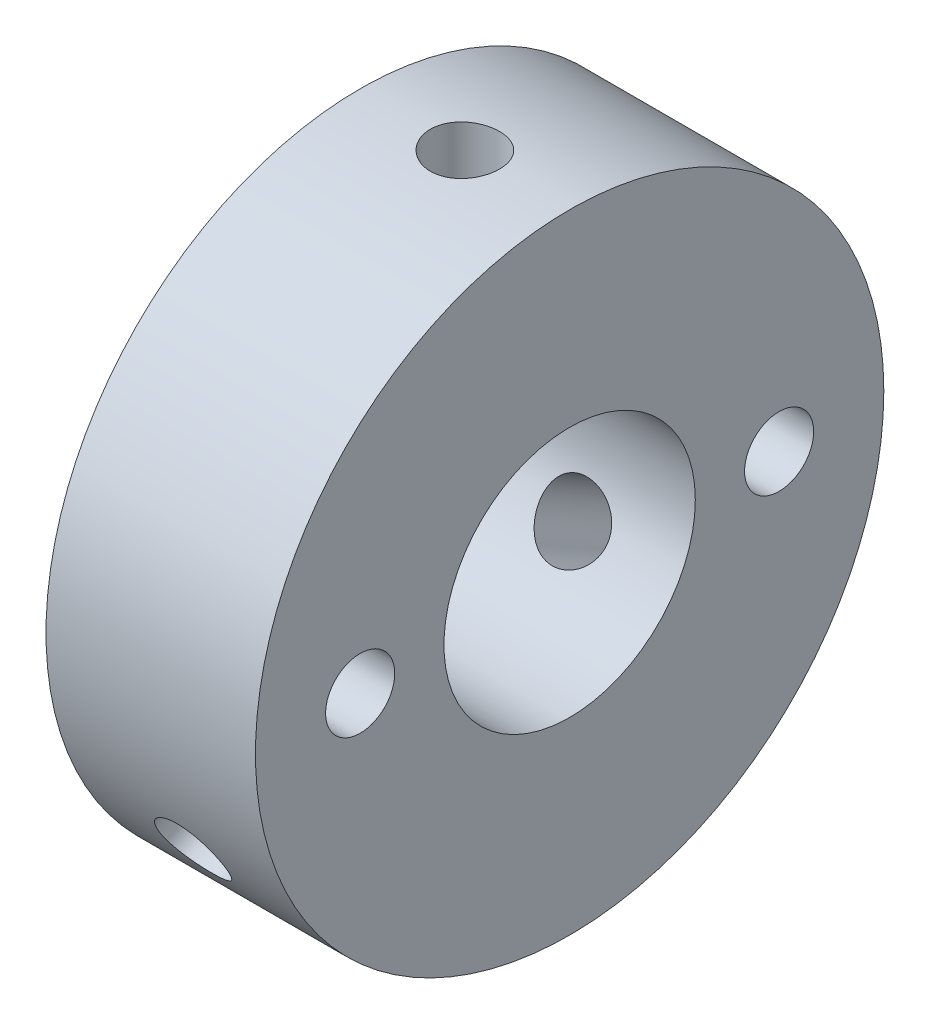
ISO-10303-21;
HEADER;
FILE_DESCRIPTION(('STEP AP214'),'2;1');
FILE_NAME('part.step','',(''),(''),'','','');
FILE_SCHEMA(('AUTOMOTIVE_DESIGN { 1 0 10303 214 1 1 1 1 }'));
ENDSEC;
DATA;
#1=APPLICATION_CONTEXT('core data for automotive mechanical design processes');
#2=APPLICATION_PROTOCOL_DEFINITION('international standard','automotive_design',2000,#1);
#3=PRODUCT_CONTEXT('',#1,'mechanical');
#4=PRODUCT('Part','Part','',(#3));
#5=PRODUCT_RELATED_PRODUCT_CATEGORY('part','',(#4));
#6=PRODUCT_DEFINITION_FORMATION('','',#4);
#7=PRODUCT_DEFINITION_CONTEXT('part definition',#1,'design');
#8=PRODUCT_DEFINITION('design','',#6,#7);
#9=PRODUCT_DEFINITION_SHAPE('','',#8);
#10=(LENGTH_UNIT() NAMED_UNIT(*) SI_UNIT(.MILLI.,.METRE.));
#11=(NAMED_UNIT(*) PLANE_ANGLE_UNIT() SI_UNIT($,.RADIAN.));
#12=(NAMED_UNIT(*) SI_UNIT($,.STERADIAN.) SOLID_ANGLE_UNIT());
#13=UNCERTAINTY_MEASURE_WITH_UNIT(LENGTH_MEASURE(1.E-05),#10,'distance_accuracy_value','');
#14=(GEOMETRIC_REPRESENTATION_CONTEXT(3) GLOBAL_UNCERTAINTY_ASSIGNED_CONTEXT((#13)) GLOBAL_UNIT_ASSIGNED_CONTEXT((#10,
#11,#12)) REPRESENTATION_CONTEXT('',''));
#15=CARTESIAN_POINT('',(0.,0.,0.));
#16=DIRECTION('',(0.,0.,1.));
#17=DIRECTION('',(1.,0.,0.));
#18=AXIS2_PLACEMENT_3D('',#15,#16,#17);
#19=CARTESIAN_POINT('',(10.,0.,0.));
#20=DIRECTION('',(-1.,0.,0.));
#21=DIRECTION('',(0.,0.,1.));
#22=AXIS2_PLACEMENT_3D('',#19,#20,#21);
#23=CYLINDRICAL_SURFACE('',#22,15.);
#24=CARTESIAN_POINT('',(10.,0.,0.));
#25=DIRECTION('',(1.,0.,0.));
#26=DIRECTION('',(0.,0.,-1.));
#27=AXIS2_PLACEMENT_3D('',#24,#25,#26);
#28=CIRCLE('',#27,15.);
#29=CARTESIAN_POINT('',(10.,0.,-15.));
#30=VERTEX_POINT('',#29);
#31=EDGE_CURVE('E10',#30,#30,#28,.T.);
#32=ORIENTED_EDGE('',*,*,#31,.F.);
#33=EDGE_LOOP('',(#32));
#34=FACE_BOUND('',#33,.T.);
#35=CARTESIAN_POINT('',(0.,0.,0.));
#36=DIRECTION('',(1.,0.,0.));
#37=DIRECTION('',(0.,0.,-1.));
#38=AXIS2_PLACEMENT_3D('',#35,#36,#37);
#39=CIRCLE('',#38,15.);
#40=CARTESIAN_POINT('',(0.,0.,-15.));
#41=VERTEX_POINT('',#40);
#42=EDGE_CURVE('E46',#41,#41,#39,.T.);
#43=ORIENTED_EDGE('',*,*,#42,.T.);
#44=EDGE_LOOP('',(#43));
#45=FACE_BOUND('',#44,.T.);
#46=CARTESIAN_POINT('',(3.35,15.,0.));
#47=CARTESIAN_POINT('',(3.35000397407824,14.9999988431375,0.0923818218581744));
#48=CARTESIAN_POINT('',(3.35778468265795,14.9991375118722,0.184823472950829));
#49=CARTESIAN_POINT('',(3.38870399434833,14.9957843241747,0.36714038463706));
#50=CARTESIAN_POINT('',(3.41185918763366,14.9932907064293,0.457012763410701));
#51=CARTESIAN_POINT('',(3.47284213795445,14.9869542195955,0.631524868732986));
#52=CARTESIAN_POINT('',(3.51066065247303,14.9831122005694,0.716167852564646));
#53=CARTESIAN_POINT('',(3.59987789047906,14.9745076566348,0.877887506534782));
#54=CARTESIAN_POINT('',(3.65127405277463,14.9697453053767,0.954965599904045));
#55=CARTESIAN_POINT('',(3.76642513016234,14.9598099458213,1.09971749291982));
#56=CARTESIAN_POINT('',(3.83022676384704,14.9546354302355,1.16735402776654));
#57=CARTESIAN_POINT('',(3.96827771795948,14.9444712876292,1.29098229654243));
#58=CARTESIAN_POINT('',(4.04252753906488,14.9394816694836,1.34697347210661));
#59=CARTESIAN_POINT('',(4.1996041169707,14.9302371294103,1.44585644392366));
#60=CARTESIAN_POINT('',(4.28245253227903,14.9259841384625,1.4887140314528));
#61=CARTESIAN_POINT('',(4.45422484675052,14.9187136159983,1.55989482430128));
#62=CARTESIAN_POINT('',(4.54314856597328,14.9156960479094,1.58821845988081));
#63=CARTESIAN_POINT('',(4.72416431324198,14.9112520065666,1.62941572162321));
#64=CARTESIAN_POINT('',(4.81624200529499,14.9098191204392,1.64235163484851));
#65=CARTESIAN_POINT('',(5.00127181424992,14.908686898868,1.65259886462405));
#66=CARTESIAN_POINT('',(5.09422390354157,14.908987508869,1.64991067288424));
#67=CARTESIAN_POINT('',(5.27793281906692,14.9112824512349,1.62903725829947));
#68=CARTESIAN_POINT('',(5.36869750429989,14.9132693261476,1.61092026760878));
#69=CARTESIAN_POINT('',(5.54589026922768,14.9187012894236,1.55980980676325));
#70=CARTESIAN_POINT('',(5.63231827929606,14.9221464011908,1.5268160978437));
#71=CARTESIAN_POINT('',(5.79859852959656,14.9301152023445,1.446814196343));
#72=CARTESIAN_POINT('',(5.8784362019399,14.9346411994129,1.39977596429643));
#73=CARTESIAN_POINT('',(6.02910998413144,14.944259925937,1.29304180674751));
#74=CARTESIAN_POINT('',(6.09994577484581,14.9493526754732,1.23334543269006));
#75=CARTESIAN_POINT('',(6.23100135292739,14.9595642939927,1.10260955971917));
#76=CARTESIAN_POINT('',(6.29116241529601,14.9646831571922,1.03151117609732));
#77=CARTESIAN_POINT('',(6.39870484603087,14.9743446474524,0.88019332942712));
#78=CARTESIAN_POINT('',(6.44608619509901,14.978887273643,0.799973852605646));
#79=CARTESIAN_POINT('',(6.52672275506592,14.9868864198642,0.632648549173301));
#80=CARTESIAN_POINT('',(6.55997472600503,14.9903426907391,0.545541148541532));
#81=CARTESIAN_POINT('',(6.61136425628381,14.9957772807096,0.366932993265997));
#82=CARTESIAN_POINT('',(6.62950236288869,14.9977556533188,0.275432397824439));
#83=CARTESIAN_POINT('',(6.65007418859382,15.0000046359516,0.0911434787578463));
#84=CARTESIAN_POINT('',(6.65258889119219,15.0002840523084,-0.00163570174845483));
#85=CARTESIAN_POINT('',(6.64205560627016,14.9991273146614,-0.186294166416551));
#86=CARTESIAN_POINT('',(6.62900787403707,14.9976911887995,-0.278173465315143));
#87=CARTESIAN_POINT('',(6.58778731886137,14.9932703044021,-0.45818836055987));
#88=CARTESIAN_POINT('',(6.55965267471051,14.9902894555646,-0.546332803398984));
#89=CARTESIAN_POINT('',(6.48909634060412,14.9831132635213,-0.716651536032795));
#90=CARTESIAN_POINT('',(6.44667426744437,14.9789178877409,-0.798825665625389));
#91=CARTESIAN_POINT('',(6.3485482782607,14.9697593637147,-0.955235638443859));
#92=CARTESIAN_POINT('',(6.29279146137031,14.9647931858517,-1.02943811324488));
#93=CARTESIAN_POINT('',(6.16965418632295,14.9546593253991,-1.1674600255377));
#94=CARTESIAN_POINT('',(6.10227337372175,14.9494916366686,-1.23127914630015));
#95=CARTESIAN_POINT('',(5.95744616179261,14.9395104302445,-1.34700625191035));
#96=CARTESIAN_POINT('',(5.87995700069063,14.9346985615749,-1.39886088486303));
#97=CARTESIAN_POINT('',(5.71732235207821,14.9259997112416,-1.48881961499014));
#98=CARTESIAN_POINT('',(5.63217698801198,14.9221127146694,-1.52692393381705));
#99=CARTESIAN_POINT('',(5.45682581030272,14.9157144017887,-1.5882121698463));
#100=CARTESIAN_POINT('',(5.36663098279506,14.913200217783,-1.61142720744416));
#101=CARTESIAN_POINT('',(5.18359422001476,14.9098235690547,-1.64237859902929));
#102=CARTESIAN_POINT('',(5.09075237824812,14.9089610460603,-1.65011549909774));
#103=CARTESIAN_POINT('',(4.9055874603336,14.9089867901201,-1.64988250778876));
#104=CARTESIAN_POINT('',(4.81326426608027,14.9098657154103,-1.64199642382743));
#105=CARTESIAN_POINT('',(4.63126321364289,14.9132553441701,-1.61091769726743));
#106=CARTESIAN_POINT('',(4.54158535753993,14.9157660489234,-1.58772504262743));
#107=CARTESIAN_POINT('',(4.36742518682386,14.9221336424926,-1.52671583943657));
#108=CARTESIAN_POINT('',(4.28294178848482,14.9259902493827,-1.48890235332836));
#109=CARTESIAN_POINT('',(4.1215068615654,14.9346156407071,-1.39973329169088));
#110=CARTESIAN_POINT('',(4.04455534231397,14.9393844262711,-1.34837769938871));
#111=CARTESIAN_POINT('',(3.8999392703203,14.9493275259266,-1.23326864168925));
#112=CARTESIAN_POINT('',(3.83232460764932,14.9545038027611,-1.16945266430597));
#113=CARTESIAN_POINT('',(3.70872907899544,14.9646609076263,-1.03136150958025));
#114=CARTESIAN_POINT('',(3.65275098597638,14.969641688842,-0.957083846303535));
#115=CARTESIAN_POINT('',(3.55388123329121,14.9788625057048,-0.799929681435439));
#116=CARTESIAN_POINT('',(3.51102915416636,14.9831002847694,-0.717028162742398));
#117=CARTESIAN_POINT('',(3.43991277149216,14.9903338724846,-0.545209885523752));
#118=CARTESIAN_POINT('',(3.41163224210026,14.993331061833,-0.456299942937422));
#119=CARTESIAN_POINT('',(3.37740874233583,14.9970040251543,-0.305751892942928));
#120=CARTESIAN_POINT('',(3.3671447762129,14.9981221898992,-0.245071615108732));
#121=CARTESIAN_POINT('',(3.35343910055461,14.9996205603388,-0.122936388450104));
#122=CARTESIAN_POINT('',(3.34999735519324,15.0000007699088,-0.0614814436954419));
#123=CARTESIAN_POINT('',(3.35,15.,0.));
#124=B_SPLINE_CURVE_WITH_KNOTS('',3,(#46,#47,#48,#49,#50,#51,#52,#53,#54,#55,#56,#57,#58,#59,
#60,#61,#62,#63,#64,#65,#66,#67,#68,#69,#70,#71,#72,#73,#74,#75,#76,#77,#78,#79,#80,#81,#82,#83,
#84,#85,#86,#87,#88,#89,#90,#91,#92,#93,#94,#95,#96,#97,#98,#99,#100,#101,#102,#103,#104,#105,
#106,#107,#108,#109,#110,#111,#112,#113,#114,#115,#116,#117,#118,#119,#120,#121,#122,#123),
.UNSPECIFIED.,.T.,.F.,(4,2,2,2,2,2,2,2,2,2,2,2,2,2,2,2,2,2,2,2,2,2,2,2,2,2,2,2,2,2,2,2,2,2,2,2,
2,2,4),(0.,0.276920934615254,0.554141173519899,0.831186959564197,1.10818052291128,
1.38623817794144,1.66430916204827,1.94309839229293,2.22187936884106,2.4995280019088,
2.77716789707699,3.05358629881209,3.33000913709783,3.60702749676352,3.88405567451859,
4.16256356312763,4.44107187229719,4.71964401084108,4.99820606199367,5.27532298117503,
5.5524353545728,5.82884975677339,6.10527157329623,6.3828087371903,6.66035436537183,
6.9391146816353,7.21787050413386,7.49604177805969,7.77420323770548,8.05087657749381,
8.32755013493494,8.60416577239309,8.88078175246171,9.15882288790672,9.43693020406013,
9.71586805930811,9.99449463424158,10.1787905045231,10.3630854069962),.UNSPECIFIED.);
#125=CARTESIAN_POINT('',(3.35,15.,0.));
#126=VERTEX_POINT('',#125);
#127=EDGE_CURVE('E63',#126,#126,#124,.T.);
#128=ORIENTED_EDGE('',*,*,#127,.F.);
#129=EDGE_LOOP('',(#128));
#130=FACE_BOUND('',#129,.T.);
#131=CARTESIAN_POINT('',(5.,-8.88342882011627,-12.0865500618633));
#132=CARTESIAN_POINT('',(4.90762008453076,-8.88342596860774,-12.0865530744519));
#133=CARTESIAN_POINT('',(4.81518033398471,-8.87712129213728,-12.0911938510877));
#134=CARTESIAN_POINT('',(4.63286737097806,-8.85203171457936,-12.1095733625383));
#135=CARTESIAN_POINT('',(4.54299704183349,-8.83323332583007,-12.1233219296705));
#136=CARTESIAN_POINT('',(4.36848927100874,-8.78360634746329,-12.1593253710765));
#137=CARTESIAN_POINT('',(4.28384855469194,-8.75278537632487,-12.181574858298));
#138=CARTESIAN_POINT('',(4.12213270201396,-8.6798411607914,-12.2336566995255));
#139=CARTESIAN_POINT('',(4.04505614523161,-8.63772004394046,-12.2634876260743));
#140=CARTESIAN_POINT('',(3.90030252503362,-8.54297311350918,-12.3296777375812));
#141=CARTESIAN_POINT('',(3.83266321124539,-8.49030705442919,-12.3660618781921));
#142=CARTESIAN_POINT('',(3.709029576799,-8.37582823968056,-12.4438853254357));
#143=CARTESIAN_POINT('',(3.6530358059785,-8.31401505237121,-12.4853248706099));
#144=CARTESIAN_POINT('',(3.55415011403971,-8.1825916556994,-12.5718490943613));
#145=CARTESIAN_POINT('',(3.51129192672872,-8.11296198823144,-12.6169427883055));
#146=CARTESIAN_POINT('',(3.44010988513695,-7.96782347734139,-12.7090979368542));
#147=CARTESIAN_POINT('',(3.41178560764294,-7.89231480518393,-12.7561593341179));
#148=CARTESIAN_POINT('',(3.37058701380557,-7.73776210934497,-12.8504940164369));
#149=CARTESIAN_POINT('',(3.35765035112212,-7.6587337073936,-12.8977656621133));
#150=CARTESIAN_POINT('',(3.34740118393401,-7.49905814680017,-12.9912541359613));
#151=CARTESIAN_POINT('',(3.35008819590006,-7.41841103833161,-13.0374709967323));
#152=CARTESIAN_POINT('',(3.37095973653297,-7.25816936633248,-13.1273524835692));
#153=CARTESIAN_POINT('',(3.38907722085951,-7.17857175984739,-13.1710272790022));
#154=CARTESIAN_POINT('',(3.4401908370904,-7.02240549017441,-13.2549494322858));
#155=CARTESIAN_POINT('',(3.47318719654549,-6.94583687332998,-13.2951967377068));
#156=CARTESIAN_POINT('',(3.55319459863276,-6.79785805700242,-13.3714650279887));
#157=CARTESIAN_POINT('',(3.60023506437928,-6.7264590822902,-13.4074769164339));
#158=CARTESIAN_POINT('',(3.7069739960156,-6.59116997153729,-13.4745013662155));
#159=CARTESIAN_POINT('',(3.76667291151885,-6.52728010233665,-13.5055137499065));
#160=CARTESIAN_POINT('',(3.89741059469749,-6.40867939413014,-13.56219675782));
#161=CARTESIAN_POINT('',(3.96850772630399,-6.35401894310649,-13.5878382315351));
#162=CARTESIAN_POINT('',(4.11982200127161,-6.25604895652372,-13.6332232388479));
#163=CARTESIAN_POINT('',(4.20003916285253,-6.21273944364184,-13.6529667606625));
#164=CARTESIAN_POINT('',(4.36736382343207,-6.13889298424707,-13.6863305304383));
#165=CARTESIAN_POINT('',(4.45447326264678,-6.10835964962303,-13.6999490469115));
#166=CARTESIAN_POINT('',(4.63308585137504,-6.0611243780417,-13.7209126921833));
#167=CARTESIAN_POINT('',(4.72458883805088,-6.04442192888934,-13.7282580532941));
#168=CARTESIAN_POINT('',(4.90887889420228,-6.02547738993881,-13.736583661443));
#169=CARTESIAN_POINT('',(5.00165674860581,-6.02316015197064,-13.7375969871412));
#170=CARTESIAN_POINT('',(5.18631226067988,-6.03286598936873,-13.7333373561973));
#171=CARTESIAN_POINT('',(5.27818993309758,-6.04488882941256,-13.7280645027121));
#172=CARTESIAN_POINT('',(5.45819661170017,-6.08280929549117,-13.7113038978248));
#173=CARTESIAN_POINT('',(5.54633464214435,-6.10867119654958,-13.6998321478787));
#174=CARTESIAN_POINT('',(5.71664130405737,-6.1733732361447,-13.6707978149811));
#175=CARTESIAN_POINT('',(5.79880977110028,-6.21221373199957,-13.6532350643357));
#176=CARTESIAN_POINT('',(5.95521584479918,-6.30177958545036,-13.6121270498285));
#177=CARTESIAN_POINT('',(6.02941947013616,-6.35255313035049,-13.5885574962154));
#178=CARTESIAN_POINT('',(6.16744410418428,-6.46426268842556,-13.5357716618075));
#179=CARTESIAN_POINT('',(6.23126480126433,-6.52519900651277,-13.5065552115854));
#180=CARTESIAN_POINT('',(6.3469953716167,-6.65560765314548,-13.4427738303876));
#181=CARTESIAN_POINT('',(6.3988518542153,-6.72511619840309,-13.4081860348307));
#182=CARTESIAN_POINT('',(6.48881382867269,-6.87029945964232,-13.3343769142981));
#183=CARTESIAN_POINT('',(6.5269195428737,-6.94597407589777,-13.2951556642563));
#184=CARTESIAN_POINT('',(6.58820868907663,-7.10101594301963,-13.2129953740799));
#185=CARTESIAN_POINT('',(6.6114238461492,-7.1803749543691,-13.1700644606553));
#186=CARTESIAN_POINT('',(6.64237630697435,-7.34056367355119,-13.0814562831971));
#187=CARTESIAN_POINT('',(6.6501141436608,-7.42139333064805,-13.0357791137817));
#188=CARTESIAN_POINT('',(6.64988390908325,-7.58173956281552,-12.9431739754115));
#189=CARTESIAN_POINT('',(6.64199850940514,-7.661260816384,-12.89625387966));
#190=CARTESIAN_POINT('',(6.61091964712493,-7.81720078165753,-12.8023302556249));
#191=CARTESIAN_POINT('',(6.58772618000518,-7.89361949244696,-12.7553267273167));
#192=CARTESIAN_POINT('',(6.52671364489208,-8.04128555182023,-12.6627534761083));
#193=CARTESIAN_POINT('',(6.48889758597174,-8.11253396078126,-12.6171834603014));
#194=CARTESIAN_POINT('',(6.39972197074954,-8.24804859871279,-12.5290158214555));
#195=CARTESIAN_POINT('',(6.34836240274566,-8.31231482165039,-12.4864182009847));
#196=CARTESIAN_POINT('',(6.23324894305902,-8.43259100958611,-12.4055107908105));
#197=CARTESIAN_POINT('',(6.16943345063016,-8.48855740208754,-12.3672238678625));
#198=CARTESIAN_POINT('',(6.0313444562852,-8.59050762643331,-12.2966269619942));
#199=CARTESIAN_POINT('',(5.95706846189108,-8.63648907245583,-12.2643184078285));
#200=CARTESIAN_POINT('',(5.79991568588812,-8.71748777958903,-12.2068786918238));
#201=CARTESIAN_POINT('',(5.717013585826,-8.75247147983865,-12.1817695198235));
#202=CARTESIAN_POINT('',(5.5451940816102,-8.81042645168114,-12.1399207234807));
#203=CARTESIAN_POINT('',(5.45628349743709,-8.83341109259968,-12.123171785101));
#204=CARTESIAN_POINT('',(5.3057375223919,-8.86120115730731,-12.1028629228983));
#205=CARTESIAN_POINT('',(5.24506011398443,-8.86952685743923,-12.0967574768708));
#206=CARTESIAN_POINT('',(5.12293063432609,-8.88064162282287,-12.0886000547953));
#207=CARTESIAN_POINT('',(5.06147856723423,-8.88343071778697,-12.0865480569943));
#208=CARTESIAN_POINT('',(5.,-8.88342882011627,-12.0865500618633));
#209=B_SPLINE_CURVE_WITH_KNOTS('',3,(#131,#132,#133,#134,#135,#136,#137,#138,#139,#140,#141,
#142,#143,#144,#145,#146,#147,#148,#149,#150,#151,#152,#153,#154,#155,#156,#157,#158,#159,#160,
#161,#162,#163,#164,#165,#166,#167,#168,#169,#170,#171,#172,#173,#174,#175,#176,#177,#178,#179,
#180,#181,#182,#183,#184,#185,#186,#187,#188,#189,#190,#191,#192,#193,#194,#195,#196,#197,#198,
#199,#200,#201,#202,#203,#204,#205,#206,#207,#208),.UNSPECIFIED.,.T.,.F.,(4,2,2,2,2,2,2,2,2,2,2,
2,2,2,2,2,2,2,2,2,2,2,2,2,2,2,2,2,2,2,2,2,2,2,2,2,2,2,4),(0.,0.276915207983228,0.55412984807806,
0.831169107214858,1.10815624312097,1.38622139272367,1.6642996680345,1.94308621188647,
2.22186463728611,2.49950964000065,2.77714605006442,3.05358226726651,3.33002271230179,
3.6070464274689,3.88407998384552,4.16258025681133,4.44108108616879,4.71966059598155,
4.99822978878068,5.27534250635456,5.55245067653742,5.8288469299171,6.10525079348408,
6.38279059615242,6.6603387273074,6.93910245036021,7.21786166575788,7.49602498056476,
7.77417871715016,8.0508645121498,8.32755038880394,8.6041793586312,8.88080856747543,
9.15884219031833,9.43694217411332,9.71588275341207,9.99451187080733,10.1787991318224,
10.3630854038514),.UNSPECIFIED.);
#210=CARTESIAN_POINT('',(5.,-8.88342882011627,-12.0865500618633));
#211=VERTEX_POINT('',#210);
#212=EDGE_CURVE('E124',#211,#211,#209,.T.);
#213=ORIENTED_EDGE('',*,*,#212,.F.);
#214=EDGE_LOOP('',(#213));
#215=FACE_BOUND('',#214,.T.);
#216=CARTESIAN_POINT('',(5.,-6.0255449876278,13.7365500618632));
#217=CARTESIAN_POINT('',(4.90762008453076,-6.02554902236031,13.7365490986787));
#218=CARTESIAN_POINT('',(4.81518033398471,-6.03272039105548,13.7334094770105));
#219=CARTESIAN_POINT('',(4.63286737097806,-6.06118230365978,13.7208710212004));
#220=CARTESIAN_POINT('',(4.54299704183349,-6.08248810643653,13.7114654225594));
#221=CARTESIAN_POINT('',(4.36848927100874,-6.13848149050118,13.6864889192837));
#222=CARTESIAN_POINT('',(4.28384855469194,-6.17316059722537,13.6709219189193));
#223=CARTESIAN_POINT('',(4.12213270201396,-6.25473690257104,13.633791295822));
#224=CARTESIAN_POINT('',(4.04505614523161,-6.30163180120621,13.6122288018677));
#225=CARTESIAN_POINT('',(3.90030252503362,-6.40632758446612,13.563270608937));
#226=CARTESIAN_POINT('',(3.83266321124539,-6.46417020407005,13.535852534162));
#227=CARTESIAN_POINT('',(3.709029576799,-6.58880669376738,13.4756226960164));
#228=CARTESIAN_POINT('',(3.6530358059785,-6.65560098626416,13.4428106781047));
#229=CARTESIAN_POINT('',(3.55415011403971,-6.79624486041153,13.3722567898109));
#230=CARTESIAN_POINT('',(3.51129192672872,-6.87011197865169,13.3345025758987));
#231=CARTESIAN_POINT('',(3.44010988513695,-7.02248993382941,13.2548865126749));
#232=CARTESIAN_POINT('',(3.41178560764294,-7.10100063547609,13.2130247830123));
#233=CARTESIAN_POINT('',(3.37058701380557,-7.2599732147417,13.1263455633519));
#234=CARTESIAN_POINT('',(3.35765035112212,-7.34042586175191,13.0815407824797));
#235=CARTESIAN_POINT('',(3.34740118393401,-7.501227035362,12.9900019275663));
#236=CARTESIAN_POINT('',(3.35008819590006,-7.58157556510717,12.9432679132763));
#237=CARTESIAN_POINT('',(3.37095973653297,-7.73953605203735,12.8494352979986));
#238=CARTESIAN_POINT('',(3.38907722085951,-7.81715833763,12.8023391464186));
#239=CARTESIAN_POINT('',(3.4401908370904,-7.96792018915041,12.7090562663093));
#240=CARTESIAN_POINT('',(3.47318719654549,-8.041059686501,12.6628695516999));
#241=CARTESIAN_POINT('',(3.55319459863276,-8.18109937155219,12.5728502826792));
#242=CARTESIAN_POINT('',(3.60023506437928,-8.24798606914001,12.5290229009968));
#243=CARTESIAN_POINT('',(3.7069739960156,-8.37367550070204,12.4453713191202));
#244=CARTESIAN_POINT('',(3.76667291151885,-8.43247794741072,12.4055472611935));
#245=CARTESIAN_POINT('',(3.89741059469749,-8.54086722632991,12.3311775389366));
#246=CARTESIAN_POINT('',(3.96850772630399,-8.59040361946954,12.2966609366254));
#247=CARTESIAN_POINT('',(4.11982200127161,-8.67869318204476,12.2345089430927));
#248=CARTESIAN_POINT('',(4.20003916285253,-8.71744632993729,12.2068735656187));
#249=CARTESIAN_POINT('',(4.36736382343207,-8.78326343182652,12.1596025406912));
#250=CARTESIAN_POINT('',(4.45447326264678,-8.81032408036622,12.1399691554812));
#251=CARTESIAN_POINT('',(4.63308585137504,-8.85209676551817,12.109544032973));
#252=CARTESIAN_POINT('',(4.72458883805088,-8.86680925941624,12.098751968257));
#253=CARTESIAN_POINT('',(4.90887889420228,-8.88349171705046,12.0865083203373));
#254=CARTESIAN_POINT('',(5.00165674860581,-8.88552790183151,12.0850081962394));
#255=CARTESIAN_POINT('',(5.18631226067988,-8.87698603452425,12.0912838825191));
#256=CARTESIAN_POINT('',(5.27818993309758,-8.86640818943373,12.0990595406801));
#257=CARTESIAN_POINT('',(5.45819661170017,-8.83293284677921,12.1235193251839));
#258=CARTESIAN_POINT('',(5.54633464214435,-8.81006706937083,12.1401805135176));
#259=CARTESIAN_POINT('',(5.71664130405737,-8.75257157970202,12.1816969570349));
#260=CARTESIAN_POINT('',(5.79880977110028,-8.71794154355532,12.206552437818));
#261=CARTESIAN_POINT('',(5.95521584479918,-8.6375580319676,12.2635647349645));
#262=CARTESIAN_POINT('',(6.02941947013616,-8.59175942733271,12.2957511378816));
#263=CARTESIAN_POINT('',(6.16744410418428,-8.49019077473793,12.3661015358162));
#264=CARTESIAN_POINT('',(6.23126480126433,-8.43442042759362,12.4042657101818));
#265=CARTESIAN_POINT('',(6.3469953716167,-8.31397980787148,12.4853122204399));
#266=CARTESIAN_POINT('',(6.3988518542153,-8.24927162562951,12.5282144886347));
#267=CARTESIAN_POINT('',(6.48881382867269,-8.11275942159765,12.6170423208058));
#268=CARTESIAN_POINT('',(6.5269195428737,-8.04095551456558,12.6629678358838));
#269=CARTESIAN_POINT('',(6.58820868907663,-7.89228168252957,12.7561578863733));
#270=CARTESIAN_POINT('',(6.6114238461492,-7.81542291522144,12.8034193495088));
#271=CARTESIAN_POINT('',(6.64237630697435,-7.65859162296858,12.8978427609911));
#272=CARTESIAN_POINT('',(6.6501141436608,-7.57861920533349,12.9450047127085));
#273=CARTESIAN_POINT('',(6.64988390908325,-7.41824768690016,13.0375660539815));
#274=CARTESIAN_POINT('',(6.64199850940514,-7.33785306524714,13.0829734318369));
#275=CARTESIAN_POINT('',(6.61091964712493,-7.17854283818048,13.1710595912115));
#276=CARTESIAN_POINT('',(6.58772618000518,-7.09962723320333,13.2137383719255));
#277=CARTESIAN_POINT('',(6.52671364489208,-6.94562341625934,13.2953343050153));
#278=CARTESIAN_POINT('',(6.48889758597174,-6.87053442043917,13.3342522292513));
#279=CARTESIAN_POINT('',(6.39972197074954,-6.72642168644112,13.4075275288617));
#280=CARTESIAN_POINT('',(6.34836240274566,-6.6573979535039,13.4418849002955));
#281=CARTESIAN_POINT('',(6.23324894305902,-6.52719198697074,13.5055934294311));
#282=CARTESIAN_POINT('',(6.16943345063016,-6.46605134281436,13.5349182856215));
#283=CARTESIAN_POINT('',(6.0313444562852,-6.3539375167309,13.5879113168923));
#284=CARTESIAN_POINT('',(5.95706846189108,-6.30296676505263,13.6115781401677));
#285=CARTESIAN_POINT('',(5.79991568588812,-6.21272315823977,13.6530052202164));
#286=CARTESIAN_POINT('',(5.71701358582599,-6.1734861272947,13.6707474073508));
#287=CARTESIAN_POINT('',(5.5451940816102,-6.10826652062277,13.7000134870706));
#288=CARTESIAN_POINT('',(5.45628349743709,-6.08226919404034,13.7115443008131));
#289=CARTESIAN_POINT('',(5.3057375223919,-6.05078617109699,13.7254567717214));
#290=CARTESIAN_POINT('',(5.24506011398443,-6.04133584966981,13.7296143165262));
#291=CARTESIAN_POINT('',(5.12293063432609,-6.02871393223119,13.7351612746677));
#292=CARTESIAN_POINT('',(5.06147856723423,-6.02554230252495,13.7365507028597));
#293=CARTESIAN_POINT('',(5.,-6.0255449876278,13.7365500618632));
#294=B_SPLINE_CURVE_WITH_KNOTS('',3,(#216,#217,#218,#219,#220,#221,#222,#223,#224,#225,#226,
#227,#228,#229,#230,#231,#232,#233,#234,#235,#236,#237,#238,#239,#240,#241,#242,#243,#244,#245,
#246,#247,#248,#249,#250,#251,#252,#253,#254,#255,#256,#257,#258,#259,#260,#261,#262,#263,#264,
#265,#266,#267,#268,#269,#270,#271,#272,#273,#274,#275,#276,#277,#278,#279,#280,#281,#282,#283,
#284,#285,#286,#287,#288,#289,#290,#291,#292,#293),.UNSPECIFIED.,.T.,.F.,(4,2,2,2,2,2,2,2,2,2,2,
2,2,2,2,2,2,2,2,2,2,2,2,2,2,2,2,2,2,2,2,2,2,2,2,2,2,2,4),(0.,0.276915207983227,0.55412984807806,
0.831169107214859,1.10815624312098,1.38622139272367,1.6642996680345,1.94308621188647,
2.22186463728611,2.49950964000065,2.77714605006442,3.05358226726651,3.33002271230179,
3.6070464274689,3.88407998384552,4.16258025681134,4.44108108616879,4.71966059598156,
4.99822978878069,5.27534250635456,5.55245067653742,5.8288469299171,6.10525079348408,
6.38279059615242,6.6603387273074,6.93910245036021,7.21786166575788,7.49602498056476,
7.77417871715016,8.0508645121498,8.32755038880394,8.6041793586312,8.88080856747542,
9.15884219031833,9.43694217411332,9.71588275341208,9.99451187080733,10.1787991318224,
10.3630854038514),.UNSPECIFIED.);
#295=CARTESIAN_POINT('',(5.,-6.0255449876278,13.7365500618632));
#296=VERTEX_POINT('',#295);
#297=EDGE_CURVE('E64',#296,#296,#294,.T.);
#298=ORIENTED_EDGE('',*,*,#297,.F.);
#299=EDGE_LOOP('',(#298));
#300=FACE_BOUND('',#299,.T.);
#301=ADVANCED_FACE('F33',(#34,#45,#130,#215,#300),#23,.T.);
#302=CARTESIAN_POINT('',(10.,0.,0.));
#303=DIRECTION('',(-1.,0.,0.));
#304=DIRECTION('',(0.,0.,1.));
#305=AXIS2_PLACEMENT_3D('',#302,#303,#304);
#306=CYLINDRICAL_SURFACE('',#305,6.);
#307=CARTESIAN_POINT('',(5.,-4.3132745946987,-4.1708107450143));
#308=CARTESIAN_POINT('',(4.90921955335825,-4.31327362433277,-4.17081298940179));
#309=CARTESIAN_POINT('',(4.81841876938433,-4.30784748333641,-4.17644554931393));
#310=CARTESIAN_POINT('',(4.63944729227741,-4.28623748767043,-4.19861883873504));
#311=CARTESIAN_POINT('',(4.55127782986673,-4.27004867899505,-4.21516459150813));
#312=CARTESIAN_POINT('',(4.38018421281183,-4.22722222320144,-4.25811029120501));
#313=CARTESIAN_POINT('',(4.29725257039649,-4.20059990285803,-4.28449578086417));
#314=CARTESIAN_POINT('',(4.13863278184509,-4.13731330507551,-4.34563766751422));
#315=CARTESIAN_POINT('',(4.06294532891123,-4.10064806791561,-4.38039486448355));
#316=CARTESIAN_POINT('',(3.91894953768282,-4.01678542987274,-4.45743715726415));
#317=CARTESIAN_POINT('',(3.85086238877202,-3.96935598238752,-4.49988316555957));
#318=CARTESIAN_POINT('',(3.72595879824098,-3.86518479101696,-4.58966967654381));
#319=CARTESIAN_POINT('',(3.66914358854209,-3.80844203050745,-4.63701071335596));
#320=CARTESIAN_POINT('',(3.56746519622698,-3.68551698127564,-4.73531982788391));
#321=CARTESIAN_POINT('',(3.52282326362093,-3.61918973009713,-4.78633612212823));
#322=CARTESIAN_POINT('',(3.44820386122523,-3.47920383162299,-4.8890351291084));
#323=CARTESIAN_POINT('',(3.41822375527836,-3.40554650512358,-4.94071772032947));
#324=CARTESIAN_POINT('',(3.37449875531735,-3.25457524877067,-5.0414054663488));
#325=CARTESIAN_POINT('',(3.3603772839833,-3.1773935530599,-5.09044516214724));
#326=CARTESIAN_POINT('',(3.34758420132032,-3.01991108399745,-5.18542050638397));
#327=CARTESIAN_POINT('',(3.34890984638381,-2.93961086706057,-5.23135670458583));
#328=CARTESIAN_POINT('',(3.36671114639083,-2.78049542648625,-5.3175953582245));
#329=CARTESIAN_POINT('',(3.38277972798328,-2.70169809855763,-5.35801582578605));
#330=CARTESIAN_POINT('',(3.4289513845931,-2.54581558685534,-5.43381442319726));
#331=CARTESIAN_POINT('',(3.45905528433458,-2.46873050397316,-5.46919225657905));
#332=CARTESIAN_POINT('',(3.53274614554669,-2.31782644398122,-5.53484670392065));
#333=CARTESIAN_POINT('',(3.57646980011384,-2.24404966789054,-5.56506656342788));
#334=CARTESIAN_POINT('',(3.67605339164662,-2.10288583295474,-5.61993016237225));
#335=CARTESIAN_POINT('',(3.73191582259504,-2.03550009127805,-5.64457275379972));
#336=CARTESIAN_POINT('',(3.85634061131931,-1.90718105771481,-5.68923818986167));
#337=CARTESIAN_POINT('',(3.9252575455875,-1.84652964343943,-5.70908429160638));
#338=CARTESIAN_POINT('',(4.07272042191696,-1.73646383172016,-5.74352055444213));
#339=CARTESIAN_POINT('',(4.15126703019763,-1.6870502124279,-5.75811035160563));
#340=CARTESIAN_POINT('',(4.31651707691904,-1.60111117459105,-5.78259997822113));
#341=CARTESIAN_POINT('',(4.40327318726382,-1.56467728551065,-5.79246666277895));
#342=CARTESIAN_POINT('',(4.5820216149048,-1.50682944292672,-5.80778533622185));
#343=CARTESIAN_POINT('',(4.67401253108294,-1.4854114905971,-5.8132385005113));
#344=CARTESIAN_POINT('',(4.85749641079511,-1.45906904849017,-5.81990529023207));
#345=CARTESIAN_POINT('',(4.94891284793571,-1.45364360556547,-5.82124773481791));
#346=CARTESIAN_POINT('',(5.13133853039988,-1.45812266331214,-5.82012749302066));
#347=CARTESIAN_POINT('',(5.2223478210242,-1.46802541370541,-5.81766524108393));
#348=CARTESIAN_POINT('',(5.39941887867531,-1.50231219549592,-5.80890325303143));
#349=CARTESIAN_POINT('',(5.4855441432779,-1.52639120075366,-5.80268427782866));
#350=CARTESIAN_POINT('',(5.6525516832155,-1.58772690177035,-5.78620127910997));
#351=CARTESIAN_POINT('',(5.73343324051216,-1.62498539775013,-5.77593670297303));
#352=CARTESIAN_POINT('',(5.8897280941801,-1.71221465093957,-5.75068884659849));
#353=CARTESIAN_POINT('',(5.96497115812137,-1.76246008212399,-5.73560169311869));
#354=CARTESIAN_POINT('',(6.10600436259986,-1.87336633845086,-5.70034016743446));
#355=CARTESIAN_POINT('',(6.17179260459153,-1.93402925008972,-5.68016477573687));
#356=CARTESIAN_POINT('',(6.29414335503753,-2.06575142640789,-5.63362143814867));
#357=CARTESIAN_POINT('',(6.35035698500714,-2.13707451047189,-5.60708103859592));
#358=CARTESIAN_POINT('',(6.44939303044249,-2.28621888356054,-5.54793915649402));
#359=CARTESIAN_POINT('',(6.49221615732852,-2.36403982708381,-5.51533799609214));
#360=CARTESIAN_POINT('',(6.56285441331323,-2.52297737742973,-5.44445504076303));
#361=CARTESIAN_POINT('',(6.59078270093574,-2.60406395106022,-5.4062189782179));
#362=CARTESIAN_POINT('',(6.63115951696826,-2.76740782569233,-5.32445159531347));
#363=CARTESIAN_POINT('',(6.64361171109341,-2.84966484478796,-5.28092153159044));
#364=CARTESIAN_POINT('',(6.65244119041157,-3.01003117262248,-5.19113516873031));
#365=CARTESIAN_POINT('',(6.64932873226352,-3.0881883210727,-5.14501380581729));
#366=CARTESIAN_POINT('',(6.6283104181902,-3.24087799483963,-5.05022623888096));
#367=CARTESIAN_POINT('',(6.61040518179519,-3.31541067181293,-5.00156014151258));
#368=CARTESIAN_POINT('',(6.56060523911145,-3.45838888515057,-4.90377376973372));
#369=CARTESIAN_POINT('',(6.52881985190943,-3.52687705981928,-4.85465992340849));
#370=CARTESIAN_POINT('',(6.45225916736823,-3.65695857244723,-4.75744211581249));
#371=CARTESIAN_POINT('',(6.40748196231652,-3.71855089598077,-4.70933830396795));
#372=CARTESIAN_POINT('',(6.30474796401359,-3.835363777432,-4.6147368638732));
#373=CARTESIAN_POINT('',(6.24645711073664,-3.89035751154595,-4.56832197731677));
#374=CARTESIAN_POINT('',(6.11897627356031,-3.99105044460746,-4.48062318960115));
#375=CARTESIAN_POINT('',(6.04978336464786,-4.03674714160646,-4.43934067078549));
#376=CARTESIAN_POINT('',(5.90048219479949,-4.11915189702648,-4.36300634437897));
#377=CARTESIAN_POINT('',(5.82015333678291,-4.15562013359965,-4.32812621752076));
#378=CARTESIAN_POINT('',(5.65207439398108,-4.21753730165412,-4.26781669673624));
#379=CARTESIAN_POINT('',(5.56432890757189,-4.24299300196357,-4.24238149887363));
#380=CARTESIAN_POINT('',(5.39750366779767,-4.27950654437983,-4.20551885127171));
#381=CARTESIAN_POINT('',(5.31910375198116,-4.29215338325743,-4.19256057772957));
#382=CARTESIAN_POINT('',(5.16047435965551,-4.30903728410726,-4.17520609584318));
#383=CARTESIAN_POINT('',(5.08024512524438,-4.31327545245097,-4.17080876109418));
#384=CARTESIAN_POINT('',(5.,-4.3132745946987,-4.1708107450143));
#385=B_SPLINE_CURVE_WITH_KNOTS('',3,(#307,#308,#309,#310,#311,#312,#313,#314,#315,#316,#317,
#318,#319,#320,#321,#322,#323,#324,#325,#326,#327,#328,#329,#330,#331,#332,#333,#334,#335,#336,
#337,#338,#339,#340,#341,#342,#343,#344,#345,#346,#347,#348,#349,#350,#351,#352,#353,#354,#355,
#356,#357,#358,#359,#360,#361,#362,#363,#364,#365,#366,#367,#368,#369,#370,#371,#372,#373,#374,
#375,#376,#377,#378,#379,#380,#381,#382,#383,#384),.UNSPECIFIED.,.T.,.F.,(4,2,2,2,2,2,2,2,2,2,2,
2,2,2,2,2,2,2,2,2,2,2,2,2,2,2,2,2,2,2,2,2,2,2,2,2,2,2,4),(0.,0.272046051104015,0.54421741051563,
0.815990441281184,1.08778945227587,1.36612384486572,1.64448864015853,1.92761862185042,
2.21069767879603,2.48690242321262,2.76305811084345,3.03181099442101,3.30057967207718,
3.57213780160766,3.84375177719016,4.12421818647043,4.40470401050125,4.68713031851458,
4.9694813862591,5.24288876991941,5.5162649363549,5.78396348444837,6.0516986123097,
6.32564040616629,6.59963713140791,6.88212071608134,7.16458929021235,7.44488018041167,
7.72510466738726,7.9962039644357,8.2672919082614,8.5362822407824,8.80531209172669,
9.08187822938627,9.35851869627828,9.64174339988021,9.92479377192829,10.1652997746179,
10.4057741306126),.UNSPECIFIED.);
#386=CARTESIAN_POINT('',(5.,-4.3132745946987,-4.1708107450143));
#387=VERTEX_POINT('',#386);
#388=EDGE_CURVE('E65',#387,#387,#385,.T.);
#389=ORIENTED_EDGE('',*,*,#388,.T.);
#390=EDGE_LOOP('',(#389));
#391=FACE_BOUND('',#390,.T.);
#392=CARTESIAN_POINT('',(0.,0.,0.));
#393=DIRECTION('',(1.,0.,0.));
#394=DIRECTION('',(0.,0.,-1.));
#395=AXIS2_PLACEMENT_3D('',#392,#393,#394);
#396=CIRCLE('',#395,6.);
#397=CARTESIAN_POINT('',(0.,0.,-6.));
#398=VERTEX_POINT('',#397);
#399=EDGE_CURVE('E54',#398,#398,#396,.T.);
#400=ORIENTED_EDGE('',*,*,#399,.F.);
#401=EDGE_LOOP('',(#400));
#402=FACE_BOUND('',#401,.T.);
#403=CARTESIAN_POINT('',(10.,0.,0.));
#404=DIRECTION('',(1.,0.,0.));
#405=DIRECTION('',(0.,0.,-1.));
#406=AXIS2_PLACEMENT_3D('',#403,#404,#405);
#407=CIRCLE('',#406,6.);
#408=CARTESIAN_POINT('',(10.,0.,-6.));
#409=VERTEX_POINT('',#408);
#410=EDGE_CURVE('E51',#409,#409,#407,.T.);
#411=ORIENTED_EDGE('',*,*,#410,.T.);
#412=EDGE_LOOP('',(#411));
#413=FACE_BOUND('',#412,.T.);
#414=CARTESIAN_POINT('',(5.,5.76866535690882,-1.65));
#415=CARTESIAN_POINT('',(4.90921955335825,5.76866681542244,-1.64999803744472));
#416=CARTESIAN_POINT('',(4.81841876938433,5.77083168489651,-1.64248258154128));
#417=CARTESIAN_POINT('',(4.63944729227741,5.77922931898766,-1.61268113160831));
#418=CARTESIAN_POINT('',(4.55127782986673,5.78546395687621,-1.59038833565188));
#419=CARTESIAN_POINT('',(4.38018421281183,5.8012427959002,-1.53182668713213));
#420=CARTESIAN_POINT('',(4.29725257039649,5.81078214006462,-1.49557833657747));
#421=CARTESIAN_POINT('',(4.13863278184509,5.83208926824761,-1.41019959185369));
#422=CARTESIAN_POINT('',(4.06294532891123,5.84385726520744,-1.36106796655278));
#423=CARTESIAN_POINT('',(3.91894953768282,5.8686465288998,-1.24991964518897));
#424=CARTESIAN_POINT('',(3.85086238877202,5.88169112663028,-1.1876215346316));
#425=CARTESIAN_POINT('',(3.72595879824098,5.90736293037452,-1.05251338107009));
#426=CARTESIAN_POINT('',(3.66914358854209,5.91999009064058,-0.979702190581914));
#427=CARTESIAN_POINT('',(3.56746519622698,5.94366575662943,-0.824091417921741));
#428=CARTESIAN_POINT('',(3.52282326362093,5.9546835378627,-0.741142186315802));
#429=CARTESIAN_POINT('',(3.44820386122523,5.97363053761389,-0.56856133857552));
#430=CARTESIAN_POINT('',(3.41822375527836,5.98156031129505,-0.478930927041653));
#431=CARTESIAN_POINT('',(3.37449875531735,5.99327282902112,-0.297842110789115));
#432=CARTESIAN_POINT('',(3.3603772839833,5.99715160352105,-0.206480953697206));
#433=CARTESIAN_POINT('',(3.34758420132032,6.00066142983201,-0.0226094627200608));
#434=CARTESIAN_POINT('',(3.34890984638381,6.00029323595966,0.0699006641776065));
#435=CARTESIAN_POINT('',(3.36671114639083,5.99542038051176,0.250818004668656));
#436=CARTESIAN_POINT('',(3.38277972798328,5.9910268682886,0.339268726185948));
#437=CARTESIAN_POINT('',(3.4289513845931,5.97872912336679,0.512166240031459));
#438=CARTESIAN_POINT('',(3.45905528433458,5.97082468436518,0.59661279675115));
#439=CARTESIAN_POINT('',(3.53274614554669,5.95223107363847,0.760126769909182));
#440=CARTESIAN_POINT('',(3.57646980011384,5.94151385162518,0.839129261966647));
#441=CARTESIAN_POINT('',(3.67605339164662,5.91844520458615,0.988812528588863));
#442=CARTESIAN_POINT('',(3.73191582259504,5.90609344393908,1.05949158844747));
#443=CARTESIAN_POINT('',(3.85634061131931,5.88061532945822,1.19295184933328));
#444=CARTESIAN_POINT('',(3.9252575455875,5.86747685059754,1.25540056574357));
#445=CARTESIAN_POINT('',(4.07272042191696,5.84226662316506,1.36793848619848));
#446=CARTESIAN_POINT('',(4.15126703019763,5.83019494849858,1.41802683438027));
#447=CARTESIAN_POINT('',(4.31651707691904,5.80843406835838,1.50469703763152));
#448=CARTESIAN_POINT('',(4.40327318726381,5.79876192329638,1.54118305341272));
#449=CARTESIAN_POINT('',(4.5820216149048,5.78310436235825,1.59894009136598));
#450=CARTESIAN_POINT('',(4.67401253108294,5.77711796499911,1.6202151643252));
#451=CARTESIAN_POINT('',(4.85749641079511,5.76972035320552,1.64636178324791));
#452=CARTESIAN_POINT('',(4.94891284793571,5.76817022285768,1.6517315769404));
#453=CARTESIAN_POINT('',(5.13133853039988,5.76943959387622,1.64729247824814));
#454=CARTESIAN_POINT('',(5.2223478210242,5.77225859634512,1.63748531887187));
#455=CARTESIAN_POINT('',(5.39941887867531,5.78181388299925,1.60341110080102));
#456=CARTESIAN_POINT('',(5.48554414327791,5.78846759511702,1.57944858294858));
#457=CARTESIAN_POINT('',(5.65255168321551,5.80486075000443,1.51808880834984));
#458=CARTESIAN_POINT('',(5.73343324051216,5.81460061430065,1.48068971625608));
#459=CARTESIAN_POINT('',(5.8897280941801,5.83634995588392,1.39252303885361));
#460=CARTESIAN_POINT('',(5.96497115812137,5.84840681329183,1.34146564228391));
#461=CARTESIAN_POINT('',(6.10600436259986,5.87332256443653,1.22778724402409));
#462=CARTESIAN_POINT('',(6.17179260459153,5.88618161851454,1.16516392562852));
#463=CARTESIAN_POINT('',(6.29414335503753,5.91173499394532,1.02781750590111));
#464=CARTESIAN_POINT('',(6.35035698500714,5.92441187573805,0.952779703449058));
#465=CARTESIAN_POINT('',(6.44939303044249,5.94776568995451,0.794045946471831));
#466=CARTESIAN_POINT('',(6.49221615732852,5.95844272861526,0.710350452233266));
#467=CARTESIAN_POINT('',(6.56285441331322,5.97652506377789,0.537265018353875));
#468=CARTESIAN_POINT('',(6.59078270093574,5.98395494908837,0.44792395441147));
#469=CARTESIAN_POINT('',(6.63115951696826,5.99481425560821,0.265580317975265));
#470=CARTESIAN_POINT('',(6.64361171109341,5.99824462414352,0.172578617937355));
#471=CARTESIAN_POINT('',(6.65244119041157,6.00067051691051,-0.011195877309034));
#472=CARTESIAN_POINT('',(6.64932873226352,5.99980681919578,-0.101942634810782));
#473=CARTESIAN_POINT('',(6.6283104181902,5.99406321514946,-0.281569554656667));
#474=CARTESIAN_POINT('',(6.61040518179519,5.98918347701204,-0.370449795011794));
#475=CARTESIAN_POINT('',(6.56060523911145,5.97598710157646,-0.543165745839328));
#476=CARTESIAN_POINT('',(6.52881985190943,5.9676973503156,-0.627035168123875));
#477=CARTESIAN_POINT('',(6.45225916736823,5.94854501555121,-0.788297966420385));
#478=CARTESIAN_POINT('',(6.40748196231652,5.93768205424174,-0.865690389200813));
#479=CARTESIAN_POINT('',(6.30474796401359,5.91416124461071,-1.01415403207421));
#480=CARTESIAN_POINT('',(6.24645711073664,5.90146164079605,-1.08498744614407));
#481=CARTESIAN_POINT('',(6.11897627356031,5.87585872928397,-1.21603947801472));
#482=CARTESIAN_POINT('',(6.04978336464787,5.86295536775691,-1.27625523789272));
#483=CARTESIAN_POINT('',(5.90048219479949,5.83805027961809,-1.38578701268236));
#484=CARTESIAN_POINT('',(5.82015333678291,5.82607732195824,-1.43480949541505));
#485=CARTESIAN_POINT('',(5.65207439398108,5.80480632889601,-1.51858609627287));
#486=CARTESIAN_POINT('',(5.56432890757189,5.79550665155144,-1.55334897834329));
#487=CARTESIAN_POINT('',(5.39750366779767,5.78183943348555,-1.60340195745889));
#488=CARTESIAN_POINT('',(5.31910375198116,5.77694065884767,-1.62083357797553));
#489=CARTESIAN_POINT('',(5.16047435965551,5.77035318708946,-1.64413270596965));
#490=CARTESIAN_POINT('',(5.08024512524438,5.76866406765974,-1.65000173479532));
#491=CARTESIAN_POINT('',(5.,5.76866535690882,-1.65));
#492=B_SPLINE_CURVE_WITH_KNOTS('',3,(#414,#415,#416,#417,#418,#419,#420,#421,#422,#423,#424,
#425,#426,#427,#428,#429,#430,#431,#432,#433,#434,#435,#436,#437,#438,#439,#440,#441,#442,#443,
#444,#445,#446,#447,#448,#449,#450,#451,#452,#453,#454,#455,#456,#457,#458,#459,#460,#461,#462,
#463,#464,#465,#466,#467,#468,#469,#470,#471,#472,#473,#474,#475,#476,#477,#478,#479,#480,#481,
#482,#483,#484,#485,#486,#487,#488,#489,#490,#491),.UNSPECIFIED.,.T.,.F.,(4,2,2,2,2,2,2,2,2,2,2,
2,2,2,2,2,2,2,2,2,2,2,2,2,2,2,2,2,2,2,2,2,2,2,2,2,2,2,4),(0.,0.272046051104015,0.54421741051563,
0.815990441281183,1.08778945227587,1.36612384486572,1.64448864015853,1.92761862185042,
2.21069767879603,2.48690242321262,2.76305811084345,3.03181099442101,3.30057967207718,
3.57213780160766,3.84375177719016,4.12421818647043,4.40470401050125,4.68713031851457,
4.9694813862591,5.24288876991941,5.5162649363549,5.78396348444837,6.0516986123097,
6.32564040616629,6.59963713140791,6.88212071608134,7.16458929021235,7.44488018041167,
7.72510466738726,7.9962039644357,8.2672919082614,8.5362822407824,8.80531209172669,
9.08187822938626,9.35851869627828,9.64174339988021,9.92479377192828,10.1652997746179,
10.4057741306125),.UNSPECIFIED.);
#493=CARTESIAN_POINT('',(5.,5.76866535690882,-1.65));
#494=VERTEX_POINT('',#493);
#495=EDGE_CURVE('E57',#494,#494,#492,.T.);
#496=ORIENTED_EDGE('',*,*,#495,.T.);
#497=EDGE_LOOP('',(#496));
#498=FACE_BOUND('',#497,.T.);
#499=CARTESIAN_POINT('',(5.,-1.45539076221011,5.82081074501426));
#500=CARTESIAN_POINT('',(4.90921955335825,-1.45539319108965,5.82081102684646));
#501=CARTESIAN_POINT('',(4.81841876938433,-1.46298420156009,5.81892813085516));
#502=CARTESIAN_POINT('',(4.63944729227741,-1.49299183131723,5.81129997034331));
#503=CARTESIAN_POINT('',(4.55127782986673,-1.51541527788115,5.80555292715997));
#504=CARTESIAN_POINT('',(4.38018421281183,-1.57402057269875,5.7899369783371));
#505=CARTESIAN_POINT('',(4.29725257039649,-1.61018223720657,5.78007411744159));
#506=CARTESIAN_POINT('',(4.13863278184509,-1.69477596317209,5.75583725936787));
#507=CARTESIAN_POINT('',(4.06294532891123,-1.74320919729181,5.74146283103628));
#508=CARTESIAN_POINT('',(3.91894953768283,-1.85186109902705,5.70735680245307));
#509=CARTESIAN_POINT('',(3.85086238877202,-1.91233514424274,5.68750470019113));
#510=CARTESIAN_POINT('',(3.72595879824098,-2.04217813935754,5.64218305761385));
#511=CARTESIAN_POINT('',(3.66914358854209,-2.11154806013312,5.61671290393783));
#512=CARTESIAN_POINT('',(3.56746519622698,-2.25814877535378,5.55941124580561));
#513=CARTESIAN_POINT('',(3.52282326362093,-2.33549380776555,5.52747830844398));
#514=CARTESIAN_POINT('',(3.44820386122523,-2.49442670599089,5.45759646768387));
#515=CARTESIAN_POINT('',(3.41822375527836,-2.57601380617145,5.41964864737108));
#516=CARTESIAN_POINT('',(3.37449875531735,-2.73869758025043,5.33924757713787));
#517=CARTESIAN_POINT('',(3.3603772839833,-2.81975805046113,5.2969261158444));
#518=CARTESIAN_POINT('',(3.34758420132032,-2.98075034583454,5.20802996910399));
#519=CARTESIAN_POINT('',(3.34890984638381,-3.06068236889906,5.16145604040818));
#520=CARTESIAN_POINT('',(3.36671114639084,-3.21492495402548,5.06677735355581));
#521=CARTESIAN_POINT('',(3.38277972798328,-3.28932876973094,5.01874709960006));
#522=CARTESIAN_POINT('',(3.4289513845931,-3.43291353651142,4.92164818316576));
#523=CARTESIAN_POINT('',(3.45905528433458,-3.50209418039199,4.87257945982786));
#524=CARTESIAN_POINT('',(3.53274614554668,-3.63440462965722,4.77471993401143));
#525=CARTESIAN_POINT('',(3.57646980011384,-3.69746418373462,4.72593730146119));
#526=CARTESIAN_POINT('',(3.67605339164662,-3.81555937163138,4.63111763378335));
#527=CARTESIAN_POINT('',(3.73191582259504,-3.870593352661,4.58508116535221));
#528=CARTESIAN_POINT('',(3.85634061131931,-3.97343427174338,4.49628634052835));
#529=CARTESIAN_POINT('',(3.9252575455875,-4.02094720715808,4.45368372586278));
#530=CARTESIAN_POINT('',(4.07272042191696,-4.10580279144487,4.37558206824361));
#531=CARTESIAN_POINT('',(4.15126703019763,-4.14314473607065,4.34008351722533));
#532=CARTESIAN_POINT('',(4.31651707691904,-4.20732289376729,4.27790294058958));
#533=CARTESIAN_POINT('',(4.40327318726381,-4.2340846377857,4.2512836093662));
#534=CARTESIAN_POINT('',(4.5820216149048,-4.27627491943149,4.20884524485584));
#535=CARTESIAN_POINT('',(4.67401253108294,-4.29170647440197,4.19302333618607));
#536=CARTESIAN_POINT('',(4.85749641079511,-4.31065130471532,4.17354350698413));
#537=CARTESIAN_POINT('',(4.94891284793571,-4.31452661729218,4.16951615787748));
#538=CARTESIAN_POINT('',(5.13133853039988,-4.31131693056404,4.17283501477249));
#539=CARTESIAN_POINT('',(5.2223478210242,-4.30423318263968,4.18017992221203));
#540=CARTESIAN_POINT('',(5.39941887867531,-4.2795016875033,4.20549215223037));
#541=CARTESIAN_POINT('',(5.48554414327791,-4.26207639436333,4.22323569488005));
#542=CARTESIAN_POINT('',(5.65255168321551,-4.21713384823405,4.26811247076009));
#543=CARTESIAN_POINT('',(5.73343324051216,-4.18961521655049,4.29524698671691));
#544=CARTESIAN_POINT('',(5.8897280941801,-4.12413530494432,4.35816580774484));
#545=CARTESIAN_POINT('',(5.96497115812137,-4.08594673116781,4.39413605083474));
#546=CARTESIAN_POINT('',(6.10600436259986,-3.99995622598563,4.47255292341033));
#547=CARTESIAN_POINT('',(6.17179260459153,-3.95215236842479,4.51500085010831));
#548=CARTESIAN_POINT('',(6.29414335503753,-3.84598356753741,4.60580393224752));
#549=CARTESIAN_POINT('',(6.35035698500714,-3.78733736526614,4.65430133514682));
#550=CARTESIAN_POINT('',(6.44939303044249,-3.66154680639394,4.75389321002215));
#551=CARTESIAN_POINT('',(6.49221615732852,-3.59440290153143,4.80498754385883));
#552=CARTESIAN_POINT('',(6.56285441331323,-3.45354768634814,4.90719002240911));
#553=CARTESIAN_POINT('',(6.59078270093574,-3.37989099802812,4.95829502380639));
#554=CARTESIAN_POINT('',(6.63115951696826,-3.22740642991586,5.05887127733816));
#555=CARTESIAN_POINT('',(6.64361171109341,-3.14857977935554,5.10834291365304));
#556=CARTESIAN_POINT('',(6.65244119041157,-2.990639344288,5.2023310460393));
#557=CARTESIAN_POINT('',(6.64932873226352,-2.91161849812306,5.24695644062803));
#558=CARTESIAN_POINT('',(6.6283104181902,-2.75318522030981,5.33179579353758));
#559=CARTESIAN_POINT('',(6.61040518179519,-2.67377280519909,5.37200993652433));
#560=CARTESIAN_POINT('',(6.56060523911145,-2.51759821642588,5.44693951557301));
#561=CARTESIAN_POINT('',(6.52881985190943,-2.4408202904963,5.48169509153232));
#562=CARTESIAN_POINT('',(6.45225916736823,-2.29158644310396,5.54574008223283));
#563=CARTESIAN_POINT('',(6.40748196231652,-2.21913115826096,5.57502869316872));
#564=CARTESIAN_POINT('',(6.30474796401359,-2.07879746717869,5.62889089594737));
#565=CARTESIAN_POINT('',(6.24645711073664,-2.01110412925008,5.6533094234608));
#566=CARTESIAN_POINT('',(6.11897627356031,-1.8848082846765,5.69666266761582));
#567=CARTESIAN_POINT('',(6.04978336464787,-1.82620822615043,5.71559590867817));
#568=CARTESIAN_POINT('',(5.90048219479949,-1.7188983825916,5.74879335706128));
#569=CARTESIAN_POINT('',(5.82015333678291,-1.67045718835858,5.76293571293576));
#570=CARTESIAN_POINT('',(5.65207439398108,-1.58726902724188,5.78640279300906));
#571=CARTESIAN_POINT('',(5.56432890757189,-1.55251364958786,5.79573047721687));
#572=CARTESIAN_POINT('',(5.39750366779767,-1.5023328891057,5.80892080873055));
#573=CARTESIAN_POINT('',(5.31910375198116,-1.48478727559023,5.81339415570505));
#574=CARTESIAN_POINT('',(5.16047435965551,-1.46131590298219,5.81933880181279));
#575=CARTESIAN_POINT('',(5.08024512524438,-1.45538861520875,5.82081049588946));
#576=CARTESIAN_POINT('',(5.,-1.45539076221011,5.82081074501426));
#577=B_SPLINE_CURVE_WITH_KNOTS('',3,(#499,#500,#501,#502,#503,#504,#505,#506,#507,#508,#509,
#510,#511,#512,#513,#514,#515,#516,#517,#518,#519,#520,#521,#522,#523,#524,#525,#526,#527,#528,
#529,#530,#531,#532,#533,#534,#535,#536,#537,#538,#539,#540,#541,#542,#543,#544,#545,#546,#547,
#548,#549,#550,#551,#552,#553,#554,#555,#556,#557,#558,#559,#560,#561,#562,#563,#564,#565,#566,
#567,#568,#569,#570,#571,#572,#573,#574,#575,#576),.UNSPECIFIED.,.T.,.F.,(4,2,2,2,2,2,2,2,2,2,2,
2,2,2,2,2,2,2,2,2,2,2,2,2,2,2,2,2,2,2,2,2,2,2,2,2,2,2,4),(0.,0.272046051104015,0.54421741051563,
0.815990441281184,1.08778945227587,1.36612384486572,1.64448864015853,1.92761862185042,
2.21069767879603,2.48690242321262,2.76305811084345,3.03181099442101,3.30057967207718,
3.57213780160766,3.84375177719016,4.12421818647043,4.40470401050125,4.68713031851458,
4.9694813862591,5.24288876991941,5.5162649363549,5.78396348444837,6.0516986123097,
6.32564040616629,6.59963713140791,6.88212071608134,7.16458929021235,7.44488018041167,
7.72510466738726,7.9962039644357,8.2672919082614,8.5362822407824,8.80531209172669,
9.08187822938626,9.35851869627828,9.64174339988021,9.92479377192828,10.1652997746179,
10.4057741306125),.UNSPECIFIED.);
#578=CARTESIAN_POINT('',(5.,-1.45539076221011,5.82081074501426));
#579=VERTEX_POINT('',#578);
#580=EDGE_CURVE('E37',#579,#579,#577,.T.);
#581=ORIENTED_EDGE('',*,*,#580,.T.);
#582=EDGE_LOOP('',(#581));
#583=FACE_BOUND('',#582,.T.);
#584=ADVANCED_FACE('F70',(#391,#402,#413,#498,#583),#306,.F.);
#585=CARTESIAN_POINT('',(10.,0.,0.));
#586=DIRECTION('',(1.,0.,0.));
#587=DIRECTION('',(0.,0.,-1.));
#588=AXIS2_PLACEMENT_3D('',#585,#586,#587);
#589=PLANE('',#588);
#590=CARTESIAN_POINT('',(10.,0.,10.));
#591=DIRECTION('',(1.,0.,0.));
#592=DIRECTION('',(0.,0.,-1.));
#593=AXIS2_PLACEMENT_3D('',#590,#591,#592);
#594=CIRCLE('',#593,1.65);
#595=CARTESIAN_POINT('',(10.,0.,8.35));
#596=VERTEX_POINT('',#595);
#597=EDGE_CURVE('E102',#596,#596,#594,.T.);
#598=ORIENTED_EDGE('',*,*,#597,.F.);
#599=EDGE_LOOP('',(#598));
#600=FACE_BOUND('',#599,.T.);
#601=ORIENTED_EDGE('',*,*,#31,.T.);
#602=EDGE_LOOP('',(#601));
#603=FACE_BOUND('',#602,.T.);
#604=ORIENTED_EDGE('',*,*,#410,.F.);
#605=EDGE_LOOP('',(#604));
#606=FACE_BOUND('',#605,.T.);
#607=CARTESIAN_POINT('',(10.,0.,-10.));
#608=DIRECTION('',(1.,0.,0.));
#609=DIRECTION('',(0.,0.,1.));
#610=AXIS2_PLACEMENT_3D('',#607,#608,#609);
#611=CIRCLE('',#610,1.65);
#612=CARTESIAN_POINT('',(10.,0.,-8.35));
#613=VERTEX_POINT('',#612);
#614=EDGE_CURVE('E96',#613,#613,#611,.T.);
#615=ORIENTED_EDGE('',*,*,#614,.F.);
#616=EDGE_LOOP('',(#615));
#617=FACE_BOUND('',#616,.T.);
#618=ADVANCED_FACE('F116',(#600,#603,#606,#617),#589,.T.);
#619=CARTESIAN_POINT('',(0.,0.,0.));
#620=DIRECTION('',(1.,0.,0.));
#621=DIRECTION('',(0.,0.,-1.));
#622=AXIS2_PLACEMENT_3D('',#619,#620,#621);
#623=PLANE('',#622);
#624=ORIENTED_EDGE('',*,*,#42,.F.);
#625=EDGE_LOOP('',(#624));
#626=FACE_BOUND('',#625,.T.);
#627=ORIENTED_EDGE('',*,*,#399,.T.);
#628=EDGE_LOOP('',(#627));
#629=FACE_BOUND('',#628,.T.);
#630=CARTESIAN_POINT('',(0.,0.,10.));
#631=DIRECTION('',(1.,0.,0.));
#632=DIRECTION('',(0.,0.,-1.));
#633=AXIS2_PLACEMENT_3D('',#630,#631,#632);
#634=CIRCLE('',#633,1.65);
#635=CARTESIAN_POINT('',(0.,0.,8.35));
#636=VERTEX_POINT('',#635);
#637=EDGE_CURVE('E99',#636,#636,#634,.T.);
#638=ORIENTED_EDGE('',*,*,#637,.T.);
#639=EDGE_LOOP('',(#638));
#640=FACE_BOUND('',#639,.T.);
#641=CARTESIAN_POINT('',(0.,0.,-10.));
#642=DIRECTION('',(1.,0.,0.));
#643=DIRECTION('',(0.,0.,1.));
#644=AXIS2_PLACEMENT_3D('',#641,#642,#643);
#645=CIRCLE('',#644,1.65);
#646=CARTESIAN_POINT('',(0.,0.,-8.35));
#647=VERTEX_POINT('',#646);
#648=EDGE_CURVE('E91',#647,#647,#645,.T.);
#649=ORIENTED_EDGE('',*,*,#648,.T.);
#650=EDGE_LOOP('',(#649));
#651=FACE_BOUND('',#650,.T.);
#652=ADVANCED_FACE('F112',(#626,#629,#640,#651),#623,.F.);
#653=CARTESIAN_POINT('',(10.,0.,10.));
#654=DIRECTION('',(-1.,0.,0.));
#655=DIRECTION('',(0.,0.,1.));
#656=AXIS2_PLACEMENT_3D('',#653,#654,#655);
#657=CYLINDRICAL_SURFACE('',#656,1.65);
#658=ORIENTED_EDGE('',*,*,#597,.T.);
#659=EDGE_LOOP('',(#658));
#660=FACE_BOUND('',#659,.T.);
#661=ORIENTED_EDGE('',*,*,#637,.F.);
#662=EDGE_LOOP('',(#661));
#663=FACE_BOUND('',#662,.T.);
#664=ADVANCED_FACE('F156',(#660,#663),#657,.F.);
#665=CARTESIAN_POINT('',(10.,0.,-10.));
#666=DIRECTION('',(-1.,0.,0.));
#667=DIRECTION('',(0.,0.,1.));
#668=AXIS2_PLACEMENT_3D('',#665,#666,#667);
#669=CYLINDRICAL_SURFACE('',#668,1.65);
#670=ORIENTED_EDGE('',*,*,#614,.T.);
#671=EDGE_LOOP('',(#670));
#672=FACE_BOUND('',#671,.T.);
#673=ORIENTED_EDGE('',*,*,#648,.F.);
#674=EDGE_LOOP('',(#673));
#675=FACE_BOUND('',#674,.T.);
#676=ADVANCED_FACE('F79',(#672,#675),#669,.F.);
#677=CARTESIAN_POINT('',(5.,15.,0.));
#678=DIRECTION('',(0.,-1.,0.));
#679=DIRECTION('',(0.,0.,-1.));
#680=AXIS2_PLACEMENT_3D('',#677,#678,#679);
#681=CYLINDRICAL_SURFACE('',#680,1.65);
#682=ORIENTED_EDGE('',*,*,#495,.F.);
#683=EDGE_LOOP('',(#682));
#684=FACE_BOUND('',#683,.T.);
#685=ORIENTED_EDGE('',*,*,#127,.T.);
#686=EDGE_LOOP('',(#685));
#687=FACE_BOUND('',#686,.T.);
#688=ADVANCED_FACE('F74',(#684,#687),#681,.F.);
#689=CARTESIAN_POINT('',(5.,-10.2451905283831,-17.7451905283833));
#690=DIRECTION('',(0.,0.499999999999992,0.866025403784443));
#691=DIRECTION('',(0.,-0.866025403784443,0.499999999999992));
#692=AXIS2_PLACEMENT_3D('',#689,#690,#691);
#693=CYLINDRICAL_SURFACE('',#692,1.65);
#694=ORIENTED_EDGE('',*,*,#388,.F.);
#695=EDGE_LOOP('',(#694));
#696=FACE_BOUND('',#695,.T.);
#697=ORIENTED_EDGE('',*,*,#212,.T.);
#698=EDGE_LOOP('',(#697));
#699=FACE_BOUND('',#698,.T.);
#700=ADVANCED_FACE('F78',(#696,#699),#693,.F.);
#701=CARTESIAN_POINT('',(5.,-10.2451905283834,17.7451905283833));
#702=DIRECTION('',(0.,0.500000000000004,-0.866025403784436));
#703=DIRECTION('',(0.,0.866025403784436,0.500000000000004));
#704=AXIS2_PLACEMENT_3D('',#701,#702,#703);
#705=CYLINDRICAL_SURFACE('',#704,1.65);
#706=ORIENTED_EDGE('',*,*,#580,.F.);
#707=EDGE_LOOP('',(#706));
#708=FACE_BOUND('',#707,.T.);
#709=ORIENTED_EDGE('',*,*,#297,.T.);
#710=EDGE_LOOP('',(#709));
#711=FACE_BOUND('',#710,.T.);
#712=ADVANCED_FACE('F81',(#708,#711),#705,.F.);
#713=CLOSED_SHELL('',(#301,#584,#618,#652,#664,#676,#688,#700,#712));
#714=MANIFOLD_SOLID_BREP('B2',#713);
#715=ADVANCED_BREP_SHAPE_REPRESENTATION('',(#18,#714),#14);
#716=SHAPE_DEFINITION_REPRESENTATION(#9,#715);
ENDSEC;
END-ISO-10303-21;
